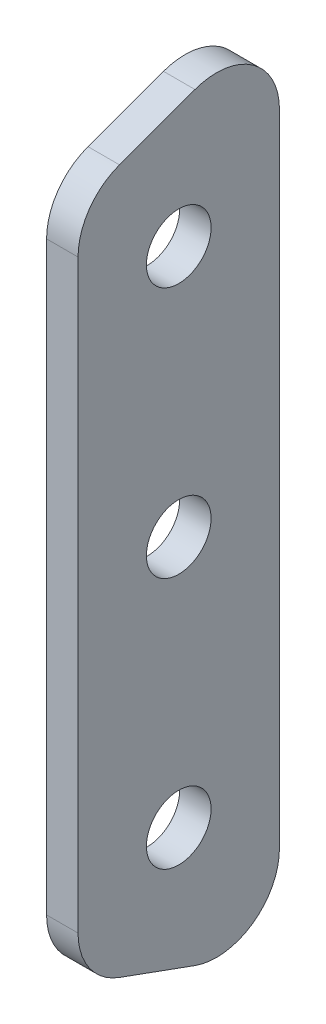
ISO-10303-21;
HEADER;
FILE_DESCRIPTION(('STEP AP214'),'2;1');
FILE_NAME('part.step','',(''),(''),'','','');
FILE_SCHEMA(('AUTOMOTIVE_DESIGN { 1 0 10303 214 1 1 1 1 }'));
ENDSEC;
DATA;
#1=APPLICATION_CONTEXT('core data for automotive mechanical design processes');
#2=APPLICATION_PROTOCOL_DEFINITION('international standard','automotive_design',2000,#1);
#3=PRODUCT_CONTEXT('',#1,'mechanical');
#4=PRODUCT('Part','Part','',(#3));
#5=PRODUCT_RELATED_PRODUCT_CATEGORY('part','',(#4));
#6=PRODUCT_DEFINITION_FORMATION('','',#4);
#7=PRODUCT_DEFINITION_CONTEXT('part definition',#1,'design');
#8=PRODUCT_DEFINITION('design','',#6,#7);
#9=PRODUCT_DEFINITION_SHAPE('','',#8);
#10=(LENGTH_UNIT() NAMED_UNIT(*) SI_UNIT(.MILLI.,.METRE.));
#11=(NAMED_UNIT(*) PLANE_ANGLE_UNIT() SI_UNIT($,.RADIAN.));
#12=(NAMED_UNIT(*) SI_UNIT($,.STERADIAN.) SOLID_ANGLE_UNIT());
#13=UNCERTAINTY_MEASURE_WITH_UNIT(LENGTH_MEASURE(1.E-05),#10,'distance_accuracy_value','');
#14=(GEOMETRIC_REPRESENTATION_CONTEXT(3) GLOBAL_UNCERTAINTY_ASSIGNED_CONTEXT((#13)) GLOBAL_UNIT_ASSIGNED_CONTEXT((#10,
#11,#12)) REPRESENTATION_CONTEXT('',''));
#15=CARTESIAN_POINT('',(0.,0.,0.));
#16=DIRECTION('',(0.,0.,1.));
#17=DIRECTION('',(1.,0.,0.));
#18=AXIS2_PLACEMENT_3D('',#15,#16,#17);
#19=CARTESIAN_POINT('',(1.5875,41.3736420629002,-24.959999991));
#20=DIRECTION('',(0.,-0.939793423425077,-0.341743063260943));
#21=DIRECTION('',(0.,0.341743063260943,-0.939793423425077));
#22=AXIS2_PLACEMENT_3D('',#19,#20,#21);
#23=PLANE('',#22);
#24=DIRECTION('',(0.,-0.341743063260943,0.939793423425077));
#25=VECTOR('',#24,1.);
#26=CARTESIAN_POINT('',(1.5875,41.3736420629002,-24.959999991));
#27=LINE('',#26,#25);
#28=CARTESIAN_POINT('',(1.5875,38.2754353514001,-16.439931539293));
#29=VERTEX_POINT('',#28);
#30=CARTESIAN_POINT('',(1.5875,35.5045262588914,-8.819931539293));
#31=VERTEX_POINT('',#30);
#32=EDGE_CURVE('E149',#29,#31,#27,.T.);
#33=ORIENTED_EDGE('',*,*,#32,.F.);
#34=DIRECTION('',(-1.,0.,0.));
#35=VECTOR('',#34,1.);
#36=CARTESIAN_POINT('',(1.5875,38.2754353514001,-16.439931539293));
#37=LINE('',#36,#35);
#38=CARTESIAN_POINT('',(-1.5875,38.2754353514001,-16.439931539293));
#39=VERTEX_POINT('',#38);
#40=EDGE_CURVE('E12',#29,#39,#37,.T.);
#41=ORIENTED_EDGE('',*,*,#40,.T.);
#42=DIRECTION('',(0.,-0.341743063260943,0.939793423425077));
#43=VECTOR('',#42,1.);
#44=CARTESIAN_POINT('',(-1.5875,41.3736420629002,-24.959999991));
#45=LINE('',#44,#43);
#46=CARTESIAN_POINT('',(-1.5875,35.5045262588914,-8.819931539293));
#47=VERTEX_POINT('',#46);
#48=EDGE_CURVE('E151',#39,#47,#45,.T.);
#49=ORIENTED_EDGE('',*,*,#48,.T.);
#50=DIRECTION('',(-1.,0.,0.));
#51=VECTOR('',#50,1.);
#52=CARTESIAN_POINT('',(1.5875,35.5045262588914,-8.819931539293));
#53=LINE('',#52,#51);
#54=EDGE_CURVE('E57',#47,#31,#53,.F.);
#55=ORIENTED_EDGE('',*,*,#54,.T.);
#56=EDGE_LOOP('',(#33,#41,#49,#55));
#57=FACE_BOUND('',#56,.T.);
#58=ADVANCED_FACE('F48',(#57),#23,.F.);
#59=CARTESIAN_POINT('',(1.5875,33.9845511495438,-4.63999999099999));
#60=DIRECTION('',(0.,0.,-1.));
#61=DIRECTION('',(0.,1.,0.));
#62=AXIS2_PLACEMENT_3D('',#59,#60,#61);
#63=PLANE('',#62);
#64=DIRECTION('',(0.,-1.,0.));
#65=VECTOR('',#64,1.);
#66=CARTESIAN_POINT('',(-1.5875,33.9845511495438,-4.63999999099999));
#67=LINE('',#66,#65);
#68=CARTESIAN_POINT('',(-1.5875,29.5368380201422,-4.63999999099999));
#69=VERTEX_POINT('',#68);
#70=CARTESIAN_POINT('',(-1.5875,-29.5368380201422,-4.63999999099999));
#71=VERTEX_POINT('',#70);
#72=EDGE_CURVE('E145',#69,#71,#67,.T.);
#73=ORIENTED_EDGE('',*,*,#72,.T.);
#74=DIRECTION('',(-1.,0.,0.));
#75=VECTOR('',#74,1.);
#76=CARTESIAN_POINT('',(1.5875,-29.5368380201422,-4.63999999099999));
#77=LINE('',#76,#75);
#78=CARTESIAN_POINT('',(1.5875,-29.5368380201422,-4.63999999099999));
#79=VERTEX_POINT('',#78);
#80=EDGE_CURVE('E121',#71,#79,#77,.F.);
#81=ORIENTED_EDGE('',*,*,#80,.T.);
#82=DIRECTION('',(0.,-1.,0.));
#83=VECTOR('',#82,1.);
#84=CARTESIAN_POINT('',(1.5875,33.9845511495438,-4.63999999099999));
#85=LINE('',#84,#83);
#86=CARTESIAN_POINT('',(1.5875,29.5368380201422,-4.63999999099999));
#87=VERTEX_POINT('',#86);
#88=EDGE_CURVE('E189',#87,#79,#85,.T.);
#89=ORIENTED_EDGE('',*,*,#88,.F.);
#90=DIRECTION('',(-1.,0.,0.));
#91=VECTOR('',#90,1.);
#92=CARTESIAN_POINT('',(1.5875,29.5368380201422,-4.63999999099999));
#93=LINE('',#92,#91);
#94=EDGE_CURVE('E127',#87,#69,#93,.T.);
#95=ORIENTED_EDGE('',*,*,#94,.T.);
#96=EDGE_LOOP('',(#73,#81,#89,#95));
#97=FACE_BOUND('',#96,.T.);
#98=ADVANCED_FACE('F225',(#97),#63,.F.);
#99=CARTESIAN_POINT('',(1.5875,-33.9845511495438,-4.63999999099999));
#100=DIRECTION('',(0.,0.939793423425077,-0.341743063260943));
#101=DIRECTION('',(0.,0.341743063260943,0.939793423425077));
#102=AXIS2_PLACEMENT_3D('',#99,#100,#101);
#103=PLANE('',#102);
#104=DIRECTION('',(0.,-0.341743063260943,-0.939793423425077));
#105=VECTOR('',#104,1.);
#106=CARTESIAN_POINT('',(1.5875,-33.9845511495438,-4.63999999099999));
#107=LINE('',#106,#105);
#108=CARTESIAN_POINT('',(1.5875,-35.5045262588914,-8.819931539293));
#109=VERTEX_POINT('',#108);
#110=CARTESIAN_POINT('',(1.5875,-38.2754353514001,-16.439931539293));
#111=VERTEX_POINT('',#110);
#112=EDGE_CURVE('E136',#109,#111,#107,.T.);
#113=ORIENTED_EDGE('',*,*,#112,.F.);
#114=DIRECTION('',(-1.,0.,0.));
#115=VECTOR('',#114,1.);
#116=CARTESIAN_POINT('',(1.5875,-35.5045262588914,-8.819931539293));
#117=LINE('',#116,#115);
#118=CARTESIAN_POINT('',(-1.5875,-35.5045262588914,-8.819931539293));
#119=VERTEX_POINT('',#118);
#120=EDGE_CURVE('E120',#109,#119,#117,.T.);
#121=ORIENTED_EDGE('',*,*,#120,.T.);
#122=DIRECTION('',(0.,-0.341743063260943,-0.939793423425077));
#123=VECTOR('',#122,1.);
#124=CARTESIAN_POINT('',(-1.5875,-33.9845511495438,-4.63999999099999));
#125=LINE('',#124,#123);
#126=CARTESIAN_POINT('',(-1.5875,-38.2754353514001,-16.439931539293));
#127=VERTEX_POINT('',#126);
#128=EDGE_CURVE('E134',#119,#127,#125,.T.);
#129=ORIENTED_EDGE('',*,*,#128,.T.);
#130=DIRECTION('',(-1.,0.,0.));
#131=VECTOR('',#130,1.);
#132=CARTESIAN_POINT('',(1.5875,-38.2754353514001,-16.439931539293));
#133=LINE('',#132,#131);
#134=EDGE_CURVE('E139',#127,#111,#133,.F.);
#135=ORIENTED_EDGE('',*,*,#134,.T.);
#136=EDGE_LOOP('',(#113,#121,#129,#135));
#137=FACE_BOUND('',#136,.T.);
#138=ADVANCED_FACE('F133',(#137),#103,.F.);
#139=CARTESIAN_POINT('',(1.5875,-41.3736420629002,-24.959999991));
#140=DIRECTION('',(0.,0.,1.));
#141=DIRECTION('',(1.,0.,0.));
#142=AXIS2_PLACEMENT_3D('',#139,#140,#141);
#143=PLANE('',#142);
#144=DIRECTION('',(0.,1.,0.));
#145=VECTOR('',#144,1.);
#146=CARTESIAN_POINT('',(1.5875,-41.3736420629002,-24.959999991));
#147=LINE('',#146,#145);
#148=CARTESIAN_POINT('',(1.5875,-32.3077471126509,-24.959999991));
#149=VERTEX_POINT('',#148);
#150=CARTESIAN_POINT('',(1.5875,32.3077471126509,-24.959999991));
#151=VERTEX_POINT('',#150);
#152=EDGE_CURVE('E156',#149,#151,#147,.T.);
#153=ORIENTED_EDGE('',*,*,#152,.F.);
#154=DIRECTION('',(-1.,0.,0.));
#155=VECTOR('',#154,1.);
#156=CARTESIAN_POINT('',(1.5875,-32.3077471126509,-24.959999991));
#157=LINE('',#156,#155);
#158=CARTESIAN_POINT('',(-1.5875,-32.3077471126509,-24.959999991));
#159=VERTEX_POINT('',#158);
#160=EDGE_CURVE('E208',#149,#159,#157,.T.);
#161=ORIENTED_EDGE('',*,*,#160,.T.);
#162=DIRECTION('',(0.,1.,0.));
#163=VECTOR('',#162,1.);
#164=CARTESIAN_POINT('',(-1.5875,-41.3736420629002,-24.959999991));
#165=LINE('',#164,#163);
#166=CARTESIAN_POINT('',(-1.5875,32.3077471126509,-24.959999991));
#167=VERTEX_POINT('',#166);
#168=EDGE_CURVE('E144',#159,#167,#165,.T.);
#169=ORIENTED_EDGE('',*,*,#168,.T.);
#170=DIRECTION('',(-1.,0.,0.));
#171=VECTOR('',#170,1.);
#172=CARTESIAN_POINT('',(1.5875,32.3077471126509,-24.959999991));
#173=LINE('',#172,#171);
#174=EDGE_CURVE('E64',#167,#151,#173,.F.);
#175=ORIENTED_EDGE('',*,*,#174,.T.);
#176=EDGE_LOOP('',(#153,#161,#169,#175));
#177=FACE_BOUND('',#176,.T.);
#178=ADVANCED_FACE('F237',(#177),#143,.F.);
#179=CARTESIAN_POINT('',(1.5875,0.,0.));
#180=DIRECTION('',(1.,0.,0.));
#181=DIRECTION('',(0.,0.,-1.));
#182=AXIS2_PLACEMENT_3D('',#179,#180,#181);
#183=PLANE('',#182);
#184=CARTESIAN_POINT('',(1.5875,0.,-14.799999991));
#185=DIRECTION('',(1.,0.,0.));
#186=DIRECTION('',(0.,0.,-1.));
#187=AXIS2_PLACEMENT_3D('',#184,#185,#186);
#188=CIRCLE('',#187,3.26389999999999);
#189=CARTESIAN_POINT('',(1.5875,0.,-18.063899991));
#190=VERTEX_POINT('',#189);
#191=EDGE_CURVE('E376',#190,#190,#188,.T.);
#192=ORIENTED_EDGE('',*,*,#191,.F.);
#193=EDGE_LOOP('',(#192));
#194=FACE_BOUND('',#193,.T.);
#195=CARTESIAN_POINT('',(1.5875,25.4,-14.799999991));
#196=DIRECTION('',(1.,0.,0.));
#197=DIRECTION('',(0.,0.,-1.));
#198=AXIS2_PLACEMENT_3D('',#195,#196,#197);
#199=CIRCLE('',#198,3.26389999999999);
#200=CARTESIAN_POINT('',(1.5875,25.4,-18.063899991));
#201=VERTEX_POINT('',#200);
#202=EDGE_CURVE('E366',#201,#201,#199,.T.);
#203=ORIENTED_EDGE('',*,*,#202,.F.);
#204=EDGE_LOOP('',(#203));
#205=FACE_BOUND('',#204,.T.);
#206=CARTESIAN_POINT('',(1.5875,-25.4,-14.799999991));
#207=DIRECTION('',(1.,0.,0.));
#208=DIRECTION('',(0.,0.,-1.));
#209=AXIS2_PLACEMENT_3D('',#206,#207,#208);
#210=CIRCLE('',#209,3.26389999999999);
#211=CARTESIAN_POINT('',(1.5875,-25.4,-18.063899991));
#212=VERTEX_POINT('',#211);
#213=EDGE_CURVE('E229',#212,#212,#210,.T.);
#214=ORIENTED_EDGE('',*,*,#213,.F.);
#215=EDGE_LOOP('',(#214));
#216=FACE_BOUND('',#215,.T.);
#217=ORIENTED_EDGE('',*,*,#88,.T.);
#218=CARTESIAN_POINT('',(1.5875,-29.5368380201422,-10.989999991));
#219=DIRECTION('',(1.,0.,0.));
#220=DIRECTION('',(0.,0.,-1.));
#221=AXIS2_PLACEMENT_3D('',#218,#219,#220);
#222=CIRCLE('',#221,6.35);
#223=EDGE_CURVE('E202',#79,#109,#222,.T.);
#224=ORIENTED_EDGE('',*,*,#223,.T.);
#225=ORIENTED_EDGE('',*,*,#112,.T.);
#226=CARTESIAN_POINT('',(1.5875,-32.3077471126509,-18.609999991));
#227=DIRECTION('',(1.,0.,0.));
#228=DIRECTION('',(0.,0.,-1.));
#229=AXIS2_PLACEMENT_3D('',#226,#227,#228);
#230=CIRCLE('',#229,6.35);
#231=EDGE_CURVE('E71',#111,#149,#230,.T.);
#232=ORIENTED_EDGE('',*,*,#231,.T.);
#233=ORIENTED_EDGE('',*,*,#152,.T.);
#234=CARTESIAN_POINT('',(1.5875,32.3077471126509,-18.609999991));
#235=DIRECTION('',(1.,0.,0.));
#236=DIRECTION('',(0.,0.,-1.));
#237=AXIS2_PLACEMENT_3D('',#234,#235,#236);
#238=CIRCLE('',#237,6.35);
#239=EDGE_CURVE('E173',#151,#29,#238,.T.);
#240=ORIENTED_EDGE('',*,*,#239,.T.);
#241=ORIENTED_EDGE('',*,*,#32,.T.);
#242=CARTESIAN_POINT('',(1.5875,29.5368380201422,-10.989999991));
#243=DIRECTION('',(1.,0.,0.));
#244=DIRECTION('',(0.,0.,-1.));
#245=AXIS2_PLACEMENT_3D('',#242,#243,#244);
#246=CIRCLE('',#245,6.35);
#247=EDGE_CURVE('E169',#31,#87,#246,.T.);
#248=ORIENTED_EDGE('',*,*,#247,.T.);
#249=EDGE_LOOP('',(#217,#224,#225,#232,#233,#240,#241,#248));
#250=FACE_BOUND('',#249,.T.);
#251=ADVANCED_FACE('F220',(#194,#205,#216,#250),#183,.T.);
#252=CARTESIAN_POINT('',(-1.5875,0.,0.));
#253=DIRECTION('',(1.,0.,0.));
#254=DIRECTION('',(0.,0.,-1.));
#255=AXIS2_PLACEMENT_3D('',#252,#253,#254);
#256=PLANE('',#255);
#257=CARTESIAN_POINT('',(-1.5875,0.,-14.799999991));
#258=DIRECTION('',(1.,0.,0.));
#259=DIRECTION('',(0.,0.,-1.));
#260=AXIS2_PLACEMENT_3D('',#257,#258,#259);
#261=CIRCLE('',#260,3.2639);
#262=CARTESIAN_POINT('',(-1.5875,0.,-18.063899991));
#263=VERTEX_POINT('',#262);
#264=EDGE_CURVE('E354',#263,#263,#261,.T.);
#265=ORIENTED_EDGE('',*,*,#264,.T.);
#266=EDGE_LOOP('',(#265));
#267=FACE_BOUND('',#266,.T.);
#268=CARTESIAN_POINT('',(-1.5875,25.4,-14.799999991));
#269=DIRECTION('',(1.,0.,0.));
#270=DIRECTION('',(0.,0.,-1.));
#271=AXIS2_PLACEMENT_3D('',#268,#269,#270);
#272=CIRCLE('',#271,3.2639);
#273=CARTESIAN_POINT('',(-1.5875,25.4,-18.063899991));
#274=VERTEX_POINT('',#273);
#275=EDGE_CURVE('E358',#274,#274,#272,.T.);
#276=ORIENTED_EDGE('',*,*,#275,.T.);
#277=EDGE_LOOP('',(#276));
#278=FACE_BOUND('',#277,.T.);
#279=CARTESIAN_POINT('',(-1.5875,-25.4,-14.799999991));
#280=DIRECTION('',(1.,0.,0.));
#281=DIRECTION('',(0.,0.,-1.));
#282=AXIS2_PLACEMENT_3D('',#279,#280,#281);
#283=CIRCLE('',#282,3.2639);
#284=CARTESIAN_POINT('',(-1.5875,-25.4,-18.063899991));
#285=VERTEX_POINT('',#284);
#286=EDGE_CURVE('E190',#285,#285,#283,.T.);
#287=ORIENTED_EDGE('',*,*,#286,.T.);
#288=EDGE_LOOP('',(#287));
#289=FACE_BOUND('',#288,.T.);
#290=ORIENTED_EDGE('',*,*,#128,.F.);
#291=CARTESIAN_POINT('',(-1.5875,-29.5368380201422,-10.989999991));
#292=DIRECTION('',(1.,0.,0.));
#293=DIRECTION('',(0.,0.,-1.));
#294=AXIS2_PLACEMENT_3D('',#291,#292,#293);
#295=CIRCLE('',#294,6.35);
#296=EDGE_CURVE('E116',#119,#71,#295,.F.);
#297=ORIENTED_EDGE('',*,*,#296,.T.);
#298=ORIENTED_EDGE('',*,*,#72,.F.);
#299=CARTESIAN_POINT('',(-1.5875,29.5368380201422,-10.989999991));
#300=DIRECTION('',(1.,0.,0.));
#301=DIRECTION('',(0.,0.,-1.));
#302=AXIS2_PLACEMENT_3D('',#299,#300,#301);
#303=CIRCLE('',#302,6.35);
#304=EDGE_CURVE('E138',#69,#47,#303,.F.);
#305=ORIENTED_EDGE('',*,*,#304,.T.);
#306=ORIENTED_EDGE('',*,*,#48,.F.);
#307=CARTESIAN_POINT('',(-1.5875,32.3077471126509,-18.609999991));
#308=DIRECTION('',(1.,0.,0.));
#309=DIRECTION('',(0.,0.,-1.));
#310=AXIS2_PLACEMENT_3D('',#307,#308,#309);
#311=CIRCLE('',#310,6.35);
#312=EDGE_CURVE('E160',#39,#167,#311,.F.);
#313=ORIENTED_EDGE('',*,*,#312,.T.);
#314=ORIENTED_EDGE('',*,*,#168,.F.);
#315=CARTESIAN_POINT('',(-1.5875,-32.3077471126509,-18.609999991));
#316=DIRECTION('',(1.,0.,0.));
#317=DIRECTION('',(0.,0.,-1.));
#318=AXIS2_PLACEMENT_3D('',#315,#316,#317);
#319=CIRCLE('',#318,6.35);
#320=EDGE_CURVE('E128',#159,#127,#319,.F.);
#321=ORIENTED_EDGE('',*,*,#320,.T.);
#322=EDGE_LOOP('',(#290,#297,#298,#305,#306,#313,#314,#321));
#323=FACE_BOUND('',#322,.T.);
#324=ADVANCED_FACE('F141',(#267,#278,#289,#323),#256,.F.);
#325=CARTESIAN_POINT('',(1.5875,-25.4,-14.799999991));
#326=DIRECTION('',(1.,0.,0.));
#327=DIRECTION('',(0.,0.,-1.));
#328=AXIS2_PLACEMENT_3D('',#325,#326,#327);
#329=CYLINDRICAL_SURFACE('',#328,3.26389999999999);
#330=ORIENTED_EDGE('',*,*,#286,.F.);
#331=EDGE_LOOP('',(#330));
#332=FACE_BOUND('',#331,.T.);
#333=ORIENTED_EDGE('',*,*,#213,.T.);
#334=EDGE_LOOP('',(#333));
#335=FACE_BOUND('',#334,.T.);
#336=ADVANCED_FACE('F266',(#332,#335),#329,.F.);
#337=CARTESIAN_POINT('',(1.5875,25.4,-14.799999991));
#338=DIRECTION('',(1.,0.,0.));
#339=DIRECTION('',(0.,0.,-1.));
#340=AXIS2_PLACEMENT_3D('',#337,#338,#339);
#341=CYLINDRICAL_SURFACE('',#340,3.26389999999999);
#342=ORIENTED_EDGE('',*,*,#275,.F.);
#343=EDGE_LOOP('',(#342));
#344=FACE_BOUND('',#343,.T.);
#345=ORIENTED_EDGE('',*,*,#202,.T.);
#346=EDGE_LOOP('',(#345));
#347=FACE_BOUND('',#346,.T.);
#348=ADVANCED_FACE('F260',(#344,#347),#341,.F.);
#349=CARTESIAN_POINT('',(1.5875,0.,-14.799999991));
#350=DIRECTION('',(1.,0.,0.));
#351=DIRECTION('',(0.,0.,-1.));
#352=AXIS2_PLACEMENT_3D('',#349,#350,#351);
#353=CYLINDRICAL_SURFACE('',#352,3.26389999999999);
#354=ORIENTED_EDGE('',*,*,#264,.F.);
#355=EDGE_LOOP('',(#354));
#356=FACE_BOUND('',#355,.T.);
#357=ORIENTED_EDGE('',*,*,#191,.T.);
#358=EDGE_LOOP('',(#357));
#359=FACE_BOUND('',#358,.T.);
#360=ADVANCED_FACE('F256',(#356,#359),#353,.F.);
#361=CARTESIAN_POINT('',(1.5875,-29.5368380201422,-10.989999991));
#362=DIRECTION('',(-1.,0.,0.));
#363=DIRECTION('',(0.,0.,1.));
#364=AXIS2_PLACEMENT_3D('',#361,#362,#363);
#365=CYLINDRICAL_SURFACE('',#364,6.35);
#366=ORIENTED_EDGE('',*,*,#223,.F.);
#367=ORIENTED_EDGE('',*,*,#80,.F.);
#368=ORIENTED_EDGE('',*,*,#296,.F.);
#369=ORIENTED_EDGE('',*,*,#120,.F.);
#370=EDGE_LOOP('',(#366,#367,#368,#369));
#371=FACE_BOUND('',#370,.T.);
#372=ADVANCED_FACE('F119',(#371),#365,.T.);
#373=CARTESIAN_POINT('',(1.5875,-32.3077471126509,-18.609999991));
#374=DIRECTION('',(-1.,0.,0.));
#375=DIRECTION('',(0.,0.,1.));
#376=AXIS2_PLACEMENT_3D('',#373,#374,#375);
#377=CYLINDRICAL_SURFACE('',#376,6.35);
#378=ORIENTED_EDGE('',*,*,#231,.F.);
#379=ORIENTED_EDGE('',*,*,#134,.F.);
#380=ORIENTED_EDGE('',*,*,#320,.F.);
#381=ORIENTED_EDGE('',*,*,#160,.F.);
#382=EDGE_LOOP('',(#378,#379,#380,#381));
#383=FACE_BOUND('',#382,.T.);
#384=ADVANCED_FACE('F235',(#383),#377,.T.);
#385=CARTESIAN_POINT('',(1.5875,32.3077471126509,-18.609999991));
#386=DIRECTION('',(-1.,0.,0.));
#387=DIRECTION('',(0.,0.,1.));
#388=AXIS2_PLACEMENT_3D('',#385,#386,#387);
#389=CYLINDRICAL_SURFACE('',#388,6.35);
#390=ORIENTED_EDGE('',*,*,#239,.F.);
#391=ORIENTED_EDGE('',*,*,#174,.F.);
#392=ORIENTED_EDGE('',*,*,#312,.F.);
#393=ORIENTED_EDGE('',*,*,#40,.F.);
#394=EDGE_LOOP('',(#390,#391,#392,#393));
#395=FACE_BOUND('',#394,.T.);
#396=ADVANCED_FACE('F239',(#395),#389,.T.);
#397=CARTESIAN_POINT('',(1.5875,29.5368380201422,-10.989999991));
#398=DIRECTION('',(-1.,0.,0.));
#399=DIRECTION('',(0.,0.,1.));
#400=AXIS2_PLACEMENT_3D('',#397,#398,#399);
#401=CYLINDRICAL_SURFACE('',#400,6.35);
#402=ORIENTED_EDGE('',*,*,#247,.F.);
#403=ORIENTED_EDGE('',*,*,#54,.F.);
#404=ORIENTED_EDGE('',*,*,#304,.F.);
#405=ORIENTED_EDGE('',*,*,#94,.F.);
#406=EDGE_LOOP('',(#402,#403,#404,#405));
#407=FACE_BOUND('',#406,.T.);
#408=ADVANCED_FACE('F50',(#407),#401,.T.);
#409=CLOSED_SHELL('',(#58,#98,#138,#178,#251,#324,#336,#348,#360,#372,#384,#396,#408));
#410=MANIFOLD_SOLID_BREP('B2',#409);
#411=ADVANCED_BREP_SHAPE_REPRESENTATION('',(#18,#410),#14);
#412=SHAPE_DEFINITION_REPRESENTATION(#9,#411);
ENDSEC;
END-ISO-10303-21;
